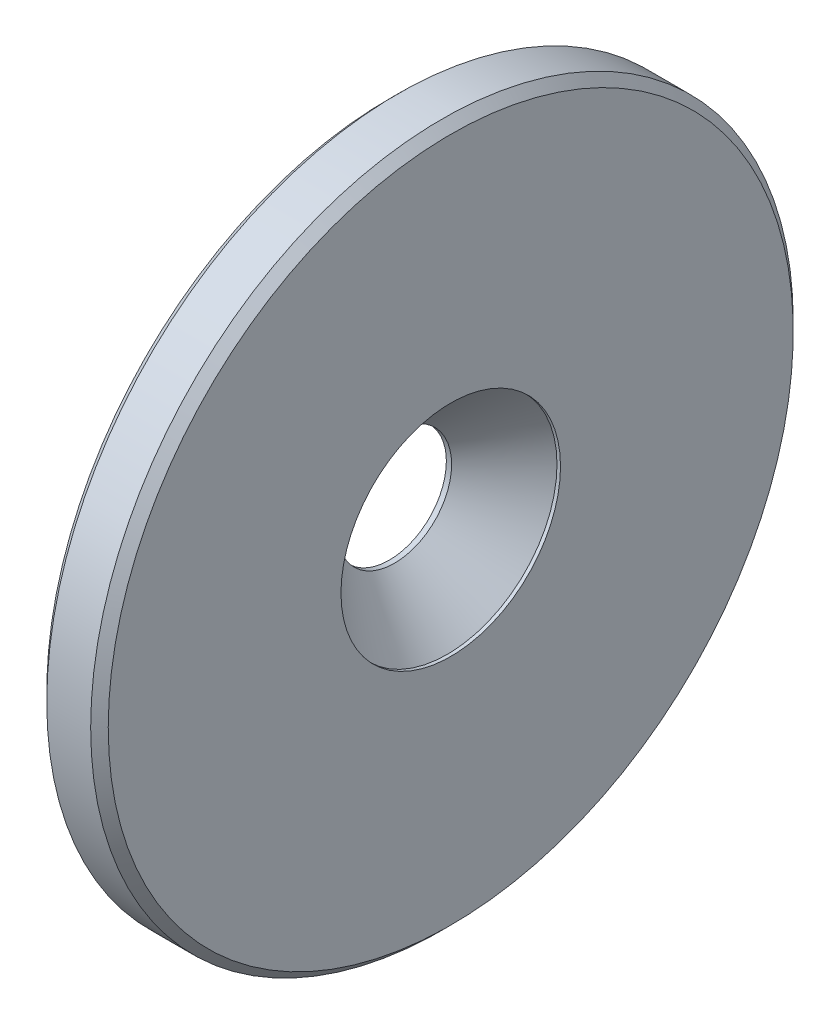
ISO-10303-21;
HEADER;
FILE_DESCRIPTION(('STEP AP214'),'2;1');
FILE_NAME('part.step','',(''),(''),'','','');
FILE_SCHEMA(('AUTOMOTIVE_DESIGN { 1 0 10303 214 1 1 1 1 }'));
ENDSEC;
DATA;
#1=APPLICATION_CONTEXT('core data for automotive mechanical design processes');
#2=APPLICATION_PROTOCOL_DEFINITION('international standard','automotive_design',2000,#1);
#3=PRODUCT_CONTEXT('',#1,'mechanical');
#4=PRODUCT('Part','Part','',(#3));
#5=PRODUCT_RELATED_PRODUCT_CATEGORY('part','',(#4));
#6=PRODUCT_DEFINITION_FORMATION('','',#4);
#7=PRODUCT_DEFINITION_CONTEXT('part definition',#1,'design');
#8=PRODUCT_DEFINITION('design','',#6,#7);
#9=PRODUCT_DEFINITION_SHAPE('','',#8);
#10=(LENGTH_UNIT() NAMED_UNIT(*) SI_UNIT(.MILLI.,.METRE.));
#11=(NAMED_UNIT(*) PLANE_ANGLE_UNIT() SI_UNIT($,.RADIAN.));
#12=(NAMED_UNIT(*) SI_UNIT($,.STERADIAN.) SOLID_ANGLE_UNIT());
#13=UNCERTAINTY_MEASURE_WITH_UNIT(LENGTH_MEASURE(1.E-05),#10,'distance_accuracy_value','');
#14=(GEOMETRIC_REPRESENTATION_CONTEXT(3) GLOBAL_UNCERTAINTY_ASSIGNED_CONTEXT((#13)) GLOBAL_UNIT_ASSIGNED_CONTEXT((#10,
#11,#12)) REPRESENTATION_CONTEXT('',''));
#15=CARTESIAN_POINT('',(0.,0.,0.));
#16=DIRECTION('',(0.,0.,1.));
#17=DIRECTION('',(1.,0.,0.));
#18=AXIS2_PLACEMENT_3D('',#15,#16,#17);
#19=CARTESIAN_POINT('',(-2.456628621,0.,19.5));
#20=CARTESIAN_POINT('',(-2.956628621,0.,20.));
#21=(BOUNDED_CURVE() B_SPLINE_CURVE(1,(#19,#20),.UNSPECIFIED.,.F.,
.F.) B_SPLINE_CURVE_WITH_KNOTS((2,2),(0.,1.0000000000001),
.UNSPECIFIED.) CURVE() GEOMETRIC_REPRESENTATION_ITEM() RATIONAL_B_SPLINE_CURVE((1.,1.)) REPRESENTATION_ITEM(''));
#22=CARTESIAN_POINT('',(997.043371379,0.,0.));
#23=DIRECTION('',(-1.,0.,0.));
#24=AXIS1_PLACEMENT('',#22,#23);
#25=SURFACE_OF_REVOLUTION('',#21,#24);
#26=CARTESIAN_POINT('',(-2.45662862100005,0.,0.));
#27=DIRECTION('',(-1.,0.,0.));
#28=DIRECTION('',(0.,0.,1.));
#29=AXIS2_PLACEMENT_3D('',#26,#27,#28);
#30=CIRCLE('',#29,19.5);
#31=CARTESIAN_POINT('',(-2.45662862100005,0.,19.5));
#32=VERTEX_POINT('',#31);
#33=EDGE_CURVE('E122',#32,#32,#30,.F.);
#34=ORIENTED_EDGE('',*,*,#33,.F.);
#35=EDGE_LOOP('',(#34));
#36=FACE_BOUND('',#35,.T.);
#37=CARTESIAN_POINT('',(-2.95662862099999,0.,0.));
#38=DIRECTION('',(-1.,0.,0.));
#39=DIRECTION('',(0.,0.,1.));
#40=AXIS2_PLACEMENT_3D('',#37,#38,#39);
#41=CIRCLE('',#40,20.);
#42=CARTESIAN_POINT('',(-2.956628621,0.,20.));
#43=VERTEX_POINT('',#42);
#44=EDGE_CURVE('E20',#43,#43,#41,.F.);
#45=ORIENTED_EDGE('',*,*,#44,.T.);
#46=EDGE_LOOP('',(#45));
#47=FACE_BOUND('',#46,.T.);
#48=ADVANCED_FACE('F15',(#36,#47),#25,.T.);
#49=CARTESIAN_POINT('',(-5.456628621,0.,-20.));
#50=CARTESIAN_POINT('',(-2.956628621,0.,-20.));
#51=(BOUNDED_CURVE() B_SPLINE_CURVE(1,(#49,#50),.UNSPECIFIED.,.F.,
.F.) B_SPLINE_CURVE_WITH_KNOTS((2,2),(0.,1.),
.UNSPECIFIED.) CURVE() GEOMETRIC_REPRESENTATION_ITEM() RATIONAL_B_SPLINE_CURVE((1.,1.)) REPRESENTATION_ITEM(''));
#52=CARTESIAN_POINT('',(-4.206628621,0.,0.));
#53=DIRECTION('',(1.,0.,0.));
#54=AXIS1_PLACEMENT('',#52,#53);
#55=SURFACE_OF_REVOLUTION('',#51,#54);
#56=ORIENTED_EDGE('',*,*,#44,.F.);
#57=EDGE_LOOP('',(#56));
#58=FACE_BOUND('',#57,.T.);
#59=CARTESIAN_POINT('',(-5.456628621,0.,0.));
#60=DIRECTION('',(1.,0.,0.));
#61=DIRECTION('',(0.,0.,-1.));
#62=AXIS2_PLACEMENT_3D('',#59,#60,#61);
#63=CIRCLE('',#62,20.);
#64=CARTESIAN_POINT('',(-5.456628621,0.,-20.));
#65=VERTEX_POINT('',#64);
#66=EDGE_CURVE('E95',#65,#65,#63,.T.);
#67=ORIENTED_EDGE('',*,*,#66,.T.);
#68=EDGE_LOOP('',(#67));
#69=FACE_BOUND('',#68,.T.);
#70=ADVANCED_FACE('F100',(#58,#69),#55,.T.);
#71=CARTESIAN_POINT('',(-2.456628621,-19.734,19.734));
#72=DIRECTION('',(1.,0.,0.));
#73=DIRECTION('',(0.,0.,-1.));
#74=AXIS2_PLACEMENT_3D('',#71,#72,#73);
#75=PLANE('',#74);
#76=CARTESIAN_POINT('',(-2.456628621,-1.70919590767886E-09,6.25));
#77=CARTESIAN_POINT('',(-2.456628621,-0.133418009315424,6.25000114171124));
#78=CARTESIAN_POINT('',(-2.456628621,-0.266827250447878,6.24573033955721));
#79=CARTESIAN_POINT('',(-2.456628621,-0.668786420216858,6.21994332536144));
#80=CARTESIAN_POINT('',(-2.456628621,-0.936609461341284,6.18529440879161));
#81=CARTESIAN_POINT('',(-2.456628621,-1.46597508643248,6.08163624863713));
#82=CARTESIAN_POINT('',(-2.456628621,-1.72750605160964,6.01256789334141));
#83=CARTESIAN_POINT('',(-2.456628621,-2.15000328894912,5.87119170776928));
#84=CARTESIAN_POINT('',(-2.456628621,-2.31422213114927,5.80842063063734));
#85=CARTESIAN_POINT('',(-2.456628621,-2.63684218021176,5.66925170217592));
#86=CARTESIAN_POINT('',(-2.456628621,-2.79524229210747,5.59285130176601));
#87=CARTESIAN_POINT('',(-2.456628621,-3.10504472139954,5.4269768801466));
#88=CARTESIAN_POINT('',(-2.456628621,-3.25644672679586,5.33750227678207));
#89=CARTESIAN_POINT('',(-2.456628621,-3.55123007634737,5.14608186922227));
#90=CARTESIAN_POINT('',(-2.456628621,-3.69460850398876,5.04413157256313));
#91=CARTESIAN_POINT('',(-2.456628621,-3.97219537464824,4.82856402150704));
#92=CARTESIAN_POINT('',(-2.456628621,-4.10640827530324,4.71495250679425));
#93=CARTESIAN_POINT('',(-2.456628621,-4.36483548940189,4.47678449351898));
#94=CARTESIAN_POINT('',(-2.456628621,-4.48904609904461,4.35222397597812));
#95=CARTESIAN_POINT('',(-2.456628621,-4.72647803530695,4.09313658085828));
#96=CARTESIAN_POINT('',(-2.456628621,-4.83970414117487,3.95861408296956));
#97=CARTESIAN_POINT('',(-2.456628621,-5.05446373599661,3.68045929162848));
#98=CARTESIAN_POINT('',(-2.456628621,-5.15599289338394,3.53682365377403));
#99=CARTESIAN_POINT('',(-2.456628621,-5.34655569549157,3.24155912841239));
#100=CARTESIAN_POINT('',(-2.456628621,-5.43559358091826,3.08993297779852));
#101=CARTESIAN_POINT('',(-2.456628621,-5.60061255979717,2.77966275136351));
#102=CARTESIAN_POINT('',(-2.456628621,-5.67658882028543,2.62101610505567));
#103=CARTESIAN_POINT('',(-2.456628621,-5.81487920816227,2.29794339417651));
#104=CARTESIAN_POINT('',(-2.456628621,-5.87719822109864,2.13351942080661));
#105=CARTESIAN_POINT('',(-2.456628621,-5.98778627703081,1.79994506528143));
#106=CARTESIAN_POINT('',(-2.456628621,-6.03605012075745,1.63079295939667));
#107=CARTESIAN_POINT('',(-2.456628621,-6.11813821940989,1.28908816765005));
#108=CARTESIAN_POINT('',(-2.456628621,-6.15196791089933,1.11653678777438));
#109=CARTESIAN_POINT('',(-2.456628621,-6.20498359898895,0.769132691892729));
#110=CARTESIAN_POINT('',(-2.456628621,-6.22416411014575,0.594279138735012));
#111=CARTESIAN_POINT('',(-2.456628621,-6.24771923141149,0.243650404742118));
#112=CARTESIAN_POINT('',(-2.456628621,-6.2520999666827,0.0678756353439615));
#113=CARTESIAN_POINT('',(-2.456628621,-6.24604017479397,-0.283498014307173));
#114=CARTESIAN_POINT('',(-2.456628621,-6.23559293051138,-0.459096778762252));
#115=CARTESIAN_POINT('',(-2.456628621,-6.19993947481932,-0.808788782308092));
#116=CARTESIAN_POINT('',(-2.456628621,-6.17473332594914,-0.982882027775158));
#117=CARTESIAN_POINT('',(-2.456628621,-6.10975615595501,-1.32824717140137));
#118=CARTESIAN_POINT('',(-2.456628621,-6.06999173706533,-1.49952031175462));
#119=CARTESIAN_POINT('',(-2.456628621,-5.97615920262878,-1.83818062505333));
#120=CARTESIAN_POINT('',(-2.456628621,-5.92208504996282,-2.00556612534847));
#121=CARTESIAN_POINT('',(-2.456628621,-5.80004828343207,-2.33512392559846));
#122=CARTESIAN_POINT('',(-2.456628621,-5.73209087304566,-2.4972981524725));
#123=CARTESIAN_POINT('',(-2.456628621,-5.58272783036744,-2.81541092236805));
#124=CARTESIAN_POINT('',(-2.456628621,-5.50131676929111,-2.97134691647388));
#125=CARTESIAN_POINT('',(-2.456628621,-5.3256773580835,-3.2757482620844));
#126=CARTESIAN_POINT('',(-2.456628621,-5.23145375305377,-3.42421635155814));
#127=CARTESIAN_POINT('',(-2.456628621,-5.03080625067261,-3.71273114849931));
#128=CARTESIAN_POINT('',(-2.456628621,-4.92437875926699,-3.85277535651915));
#129=CARTESIAN_POINT('',(-2.456628621,-4.70014429196179,-4.12334876742316));
#130=CARTESIAN_POINT('',(-2.456628621,-4.58234153137009,-4.25388146374337));
#131=CARTESIAN_POINT('',(-2.456628621,-4.33613494365613,-4.5045874301741));
#132=CARTESIAN_POINT('',(-2.456628621,-4.20772891464338,-4.62475853793711));
#133=CARTESIAN_POINT('',(-2.456628621,-3.94129918623,-4.85381419298259));
#134=CARTESIAN_POINT('',(-2.456628621,-3.80327905212002,-4.96270288735932));
#135=CARTESIAN_POINT('',(-2.456628621,-3.51845041329473,-5.16854963408473));
#136=CARTESIAN_POINT('',(-2.456628621,-3.37163526433438,-5.26549849306785));
#137=CARTESIAN_POINT('',(-2.456628621,-3.07041259358816,-5.44664505528296));
#138=CARTESIAN_POINT('',(-2.456628621,-2.91600789350336,-5.53084745069657));
#139=CARTESIAN_POINT('',(-2.456628621,-2.60048817378036,-5.68602694346657));
#140=CARTESIAN_POINT('',(-2.456628621,-2.43936627008721,-5.75699004369127));
#141=CARTESIAN_POINT('',(-2.456628621,-2.11177246890117,-5.88505170952893));
#142=CARTESIAN_POINT('',(-2.456628621,-1.94530260138815,-5.94215546707557));
#143=CARTESIAN_POINT('',(-2.456628621,-1.60836902858592,-6.04205990112899));
#144=CARTESIAN_POINT('',(-2.456628621,-1.43791090876787,-6.08487943336063));
#145=CARTESIAN_POINT('',(-2.456628621,-1.09406311004606,-6.15599911285454));
#146=CARTESIAN_POINT('',(-2.456628621,-0.92067487735144,-6.1843062185607));
#147=CARTESIAN_POINT('',(-2.456628621,-0.622556699400929,-6.22016884635642));
#148=CARTESIAN_POINT('',(-2.456628621,-0.498250501425751,-6.23135771552954));
#149=CARTESIAN_POINT('',(-2.456628621,-0.24929337661775,-6.24626938971483));
#150=CARTESIAN_POINT('',(-2.456628621,-0.124642862885092,-6.24999893333965));
#151=CARTESIAN_POINT('',(-2.456628621,0.133418007231994,-6.25000114175571));
#152=CARTESIAN_POINT('',(-2.456628621,0.266827248365936,-6.24573033964615));
#153=CARTESIAN_POINT('',(-2.456628621,0.668786418143677,-6.21994332558437));
#154=CARTESIAN_POINT('',(-2.456628621,0.936609459279663,-6.1852944091038));
#155=CARTESIAN_POINT('',(-2.456628621,1.46597508440537,-6.08163624912575));
#156=CARTESIAN_POINT('',(-2.456628621,1.72750604960551,-6.01256789391722));
#157=CARTESIAN_POINT('',(-2.456628621,2.15000328699205,-5.87119170848595));
#158=CARTESIAN_POINT('',(-2.456628621,2.31422212921312,-5.80842063140875));
#159=CARTESIAN_POINT('',(-2.456628621,2.63684217832198,-5.66925170305488));
#160=CARTESIAN_POINT('',(-2.456628621,2.79524229024315,-5.59285130269777));
#161=CARTESIAN_POINT('',(-2.456628621,3.10504471959051,-5.42697688118163));
#162=CARTESIAN_POINT('',(-2.456628621,3.25644672501667,-5.33750227786757));
#163=CARTESIAN_POINT('',(-2.456628621,3.55123007463199,-5.14608187040602));
#164=CARTESIAN_POINT('',(-2.456628621,3.69460850230738,-5.04413157379467));
#165=CARTESIAN_POINT('',(-2.456628621,3.97219537303872,-4.8285640228311));
#166=CARTESIAN_POINT('',(-2.456628621,4.10640827373159,-4.71495250816305));
#167=CARTESIAN_POINT('',(-2.456628621,4.36483548790963,-4.47678449497392));
#168=CARTESIAN_POINT('',(-2.456628621,4.48904609759388,-4.35222397747446));
#169=CARTESIAN_POINT('',(-2.456628621,4.72647803394258,-4.09313658243376));
#170=CARTESIAN_POINT('',(-2.456628621,4.83970413985533,-3.95861408458279));
#171=CARTESIAN_POINT('',(-2.456628621,5.05446373476979,-3.6804592933133));
#172=CARTESIAN_POINT('',(-2.456628621,5.155992892205,-3.53682365549269));
#173=CARTESIAN_POINT('',(-2.456628621,5.34655569441105,-3.24155913019457));
#174=CARTESIAN_POINT('',(-2.456628621,5.43559357988829,-3.08993297961038));
#175=CARTESIAN_POINT('',(-2.456628621,5.60061255887061,-2.77966275323038));
#176=CARTESIAN_POINT('',(-2.456628621,5.67658881941176,-2.62101610694787));
#177=CARTESIAN_POINT('',(-2.456628621,5.81487920739629,-2.2979433961148));
#178=CARTESIAN_POINT('',(-2.456628621,5.87719822038747,-2.13351942276568));
#179=CARTESIAN_POINT('',(-2.456628621,5.98778627643082,-1.79994506727736));
#180=CARTESIAN_POINT('',(-2.456628621,6.03605012021386,-1.63079296140868));
#181=CARTESIAN_POINT('',(-2.456628621,6.11813821898019,-1.28908816968943));
#182=CARTESIAN_POINT('',(-2.456628621,6.15196791052715,-1.11653678982504));
#183=CARTESIAN_POINT('',(-2.456628621,6.20498359873257,-0.769132693961054));
#184=CARTESIAN_POINT('',(-2.456628621,6.22416410994766,-0.594279140809731));
#185=CARTESIAN_POINT('',(-2.456628621,6.24771923133027,-0.243650406824689));
#186=CARTESIAN_POINT('',(-2.456628621,6.25209996666007,-0.0678756374279923));
#187=CARTESIAN_POINT('',(-2.456628621,6.24604017488847,0.283498012225163));
#188=CARTESIAN_POINT('',(-2.456628621,6.23559293066441,0.459096776683724));
#189=CARTESIAN_POINT('',(-2.456628621,6.19993947508891,0.808788780241453));
#190=CARTESIAN_POINT('',(-2.456628621,6.17473332627676,0.982882025716926));
#191=CARTESIAN_POINT('',(-2.456628621,6.10975615639776,1.3282471693648));
#192=CARTESIAN_POINT('',(-2.456628621,6.06999173756516,1.49952030973132));
#193=CARTESIAN_POINT('',(-2.456628621,5.9761592032415,1.83818062306131));
#194=CARTESIAN_POINT('',(-2.456628621,5.92208505063134,2.00556612337446));
#195=CARTESIAN_POINT('',(-2.456628621,5.80004828421044,2.33512392366512));
#196=CARTESIAN_POINT('',(-2.456628621,5.73209087387809,2.49729815056181));
#197=CARTESIAN_POINT('',(-2.456628621,5.58272783130593,2.81541092050711));
#198=CARTESIAN_POINT('',(-2.456628621,5.50131677028159,2.97134691464005));
#199=CARTESIAN_POINT('',(-2.456628621,5.32567735917547,3.27574826030907));
#200=CARTESIAN_POINT('',(-2.456628621,5.23145375419526,3.4242163498142));
#201=CARTESIAN_POINT('',(-2.456628621,5.03080625191028,3.71273114682226));
#202=CARTESIAN_POINT('',(-2.456628621,4.92437876055132,3.8527753548776));
#203=CARTESIAN_POINT('',(-2.456628621,4.70014429333628,4.12334876585641));
#204=CARTESIAN_POINT('',(-2.456628621,4.58234153278807,4.2538814622159));
#205=CARTESIAN_POINT('',(-2.456628621,4.33613494515756,4.50458742872883));
#206=CARTESIAN_POINT('',(-2.456628621,4.20772891618476,4.62475853653473));
#207=CARTESIAN_POINT('',(-2.456628621,3.9412991878475,4.85381419166919));
#208=CARTESIAN_POINT('',(-2.456628621,3.80327905377369,4.96270288609199));
#209=CARTESIAN_POINT('',(-2.456628621,3.51845041501699,5.16854963291231));
#210=CARTESIAN_POINT('',(-2.456628621,3.37163526608906,5.26549849194427));
#211=CARTESIAN_POINT('',(-2.456628621,3.07041259540346,5.44664505425963));
#212=CARTESIAN_POINT('',(-2.456628621,2.91600789534684,5.53084744972463));
#213=CARTESIAN_POINT('',(-2.456628621,2.60048817567623,5.68602694259948));
#214=CARTESIAN_POINT('',(-2.456628621,2.43936627200728,5.75699004287767));
#215=CARTESIAN_POINT('',(-2.456628621,2.11177247086507,5.8850517088242));
#216=CARTESIAN_POINT('',(-2.456628621,1.94530260337166,5.9421554664262));
#217=CARTESIAN_POINT('',(-2.456628621,1.60836903060288,6.04205990059209));
#218=CARTESIAN_POINT('',(-2.456628621,1.43791091079864,6.08487943288075));
#219=CARTESIAN_POINT('',(-2.456628621,1.09406311209952,6.15599911248962));
#220=CARTESIAN_POINT('',(-2.456628621,0.920674879413773,6.1843062182537));
#221=CARTESIAN_POINT('',(-2.456628621,0.622556700784297,6.2201688462319));
#222=CARTESIAN_POINT('',(-2.456628621,0.498250502117834,6.23135771548813));
#223=CARTESIAN_POINT('',(-2.456628621,0.249293375923345,6.24626938975639));
#224=CARTESIAN_POINT('',(-2.456628621,0.124642861495489,6.24999893338118));
#225=CARTESIAN_POINT('',(-2.456628621,-1.70919590767886E-09,6.25));
#226=B_SPLINE_CURVE_WITH_KNOTS('',3,(#76,#77,#78,#79,#80,#81,#82,#83,#84,#85,#86,#87,#88,#89,
#90,#91,#92,#93,#94,#95,#96,#97,#98,#99,#100,#101,#102,#103,#104,#105,#106,#107,#108,#109,#110,
#111,#112,#113,#114,#115,#116,#117,#118,#119,#120,#121,#122,#123,#124,#125,#126,#127,#128,#129,
#130,#131,#132,#133,#134,#135,#136,#137,#138,#139,#140,#141,#142,#143,#144,#145,#146,#147,#148,
#149,#150,#151,#152,#153,#154,#155,#156,#157,#158,#159,#160,#161,#162,#163,#164,#165,#166,#167,
#168,#169,#170,#171,#172,#173,#174,#175,#176,#177,#178,#179,#180,#181,#182,#183,#184,#185,#186,
#187,#188,#189,#190,#191,#192,#193,#194,#195,#196,#197,#198,#199,#200,#201,#202,#203,#204,#205,
#206,#207,#208,#209,#210,#211,#212,#213,#214,#215,#216,#217,#218,#219,#220,#221,#222,#223,#224,
#225),.UNSPECIFIED.,.T.,.F.,(4,2,2,2,2,2,2,2,2,2,2,2,2,2,2,2,2,2,2,2,2,2,2,2,2,2,2,2,2,2,2,2,2,
2,2,2,2,2,2,2,2,2,2,2,2,2,2,2,2,2,2,2,2,2,2,2,2,2,2,2,2,2,2,2,2,2,2,2,2,2,2,2,2,2,4),(0.,
0.400205167889901,1.20795084206719,2.01708853877291,2.54393813744209,3.07088637583592,
3.59785808480761,4.12502011639972,4.65192391042903,5.17902192572155,5.70588956759682,
6.232951694047,6.75983445103648,7.28691174356751,7.8138001781356,8.34088327169625,
8.86776766596892,9.3948492575831,9.92171267994428,10.4488148493285,10.9759147851895,
11.502775974604,12.0298597963015,12.5567464269608,13.0838461871163,13.610751265849,
14.1378119190152,14.6646780046075,15.1916537764723,15.7184351547002,16.245619638257,
16.7726095821834,17.3001535629329,17.8274996110861,18.3541467619413,18.8805411583665,
19.2547623214926,19.6286452673745,20.0288504352644,20.8365961094419,21.6457338061474,
22.1725834048166,22.6995316432104,23.2265033521821,23.7536653837742,24.2805691778035,
24.8076671930961,25.3345348349713,25.8615969614215,26.388479718411,26.915557010942,
27.4424454455101,27.9695285390708,28.4964129333434,29.0234945249576,29.5503579473188,
30.0774601167031,30.604560052564,31.1314212419785,31.658505063676,32.1853916943353,
32.7124914544908,33.2393965332233,33.7664571863896,34.293323271982,34.8202990438472,
35.3470804220756,35.874264905632,36.4012548495579,36.9287988303056,37.4561448784571,
37.9827920293137,38.5091864257411,38.8834075909513,39.2572905389138),.UNSPECIFIED.);
#227=CARTESIAN_POINT('',(-2.456628621,-1.70919590767886E-09,6.25));
#228=VERTEX_POINT('',#227);
#229=EDGE_CURVE('E87',#228,#228,#226,.T.);
#230=ORIENTED_EDGE('',*,*,#229,.F.);
#231=EDGE_LOOP('',(#230));
#232=FACE_BOUND('',#231,.T.);
#233=ORIENTED_EDGE('',*,*,#33,.T.);
#234=EDGE_LOOP('',(#233));
#235=FACE_BOUND('',#234,.T.);
#236=ADVANCED_FACE('F96',(#232,#235),#75,.T.);
#237=CARTESIAN_POINT('',(-5.956628621,0.,-19.5));
#238=CARTESIAN_POINT('',(-5.456628621,0.,-20.));
#239=(BOUNDED_CURVE() B_SPLINE_CURVE(1,(#237,#238),.UNSPECIFIED.,.F.,
.F.) B_SPLINE_CURVE_WITH_KNOTS((2,2),(0.,1.),
.UNSPECIFIED.) CURVE() GEOMETRIC_REPRESENTATION_ITEM() RATIONAL_B_SPLINE_CURVE((1.,1.)) REPRESENTATION_ITEM(''));
#240=CARTESIAN_POINT('',(-1005.456628621,0.,0.));
#241=DIRECTION('',(1.,0.,0.));
#242=AXIS1_PLACEMENT('',#240,#241);
#243=SURFACE_OF_REVOLUTION('',#239,#242);
#244=ORIENTED_EDGE('',*,*,#66,.F.);
#245=EDGE_LOOP('',(#244));
#246=FACE_BOUND('',#245,.T.);
#247=CARTESIAN_POINT('',(-5.95662862099999,0.,0.));
#248=DIRECTION('',(1.,0.,0.));
#249=DIRECTION('',(0.,0.,-1.));
#250=AXIS2_PLACEMENT_3D('',#247,#248,#249);
#251=CIRCLE('',#250,19.5);
#252=CARTESIAN_POINT('',(-5.95662862099999,0.,-19.5));
#253=VERTEX_POINT('',#252);
#254=EDGE_CURVE('E94',#253,#253,#251,.F.);
#255=ORIENTED_EDGE('',*,*,#254,.F.);
#256=EDGE_LOOP('',(#255));
#257=FACE_BOUND('',#256,.T.);
#258=ADVANCED_FACE('F83',(#246,#257),#243,.T.);
#259=CARTESIAN_POINT('',(-2.656628621,0.,-6.25));
#260=CARTESIAN_POINT('',(-2.456628621,0.,-6.25));
#261=(BOUNDED_CURVE() B_SPLINE_CURVE(1,(#259,#260),.UNSPECIFIED.,.F.,
.F.) B_SPLINE_CURVE_WITH_KNOTS((2,2),(0.,1.),
.UNSPECIFIED.) CURVE() GEOMETRIC_REPRESENTATION_ITEM() RATIONAL_B_SPLINE_CURVE((1.,1.)) REPRESENTATION_ITEM(''));
#262=CARTESIAN_POINT('',(-2.556628621,0.,0.));
#263=DIRECTION('',(1.,0.,0.));
#264=AXIS1_PLACEMENT('',#262,#263);
#265=SURFACE_OF_REVOLUTION('',#261,#264);
#266=ORIENTED_EDGE('',*,*,#229,.T.);
#267=EDGE_LOOP('',(#266));
#268=FACE_BOUND('',#267,.T.);
#269=CARTESIAN_POINT('',(-2.65662862100002,0.,0.));
#270=DIRECTION('',(1.,0.,0.));
#271=DIRECTION('',(0.,0.,-1.));
#272=AXIS2_PLACEMENT_3D('',#269,#270,#271);
#273=CIRCLE('',#272,6.25);
#274=CARTESIAN_POINT('',(-2.656628621,0.,-6.25));
#275=VERTEX_POINT('',#274);
#276=EDGE_CURVE('E34',#275,#275,#273,.T.);
#277=ORIENTED_EDGE('',*,*,#276,.F.);
#278=EDGE_LOOP('',(#277));
#279=FACE_BOUND('',#278,.T.);
#280=ADVANCED_FACE('F79',(#268,#279),#265,.F.);
#281=CARTESIAN_POINT('',(-5.956628621,-19.734,-19.734));
#282=DIRECTION('',(-1.,0.,0.));
#283=DIRECTION('',(0.,0.,1.));
#284=AXIS2_PLACEMENT_3D('',#281,#282,#283);
#285=PLANE('',#284);
#286=CARTESIAN_POINT('',(-5.956628621,-1.94550505696004E-10,-3.25));
#287=CARTESIAN_POINT('',(-5.956628621,-0.100569859287421,-3.25000170918039));
#288=CARTESIAN_POINT('',(-5.956628621,-0.20111673016682,-3.24532784070037));
#289=CARTESIAN_POINT('',(-5.956628621,-0.401381428199554,-3.22668853590113));
#290=CARTESIAN_POINT('',(-5.956628621,-0.501098830869839,-3.21271860684454));
#291=CARTESIAN_POINT('',(-5.956628621,-0.779387033086154,-3.16042874204492));
#292=CARTESIAN_POINT('',(-5.956628621,-0.956088761260602,-3.11154464042386));
#293=CARTESIAN_POINT('',(-5.956628621,-1.29892643996143,-2.98475805991951));
#294=CARTESIAN_POINT('',(-5.956628621,-1.46504820033837,-2.90681753103513));
#295=CARTESIAN_POINT('',(-5.956628621,-1.78177808204428,-2.72417875025682));
#296=CARTESIAN_POINT('',(-5.956628621,-1.93239414332093,-2.61949428961178));
#297=CARTESIAN_POINT('',(-5.956628621,-2.21386439151047,-2.38635630356589));
#298=CARTESIAN_POINT('',(-5.956628621,-2.34472416457148,-2.25790951997646));
#299=CARTESIAN_POINT('',(-5.956628621,-2.58304119723127,-1.98085545805101));
#300=CARTESIAN_POINT('',(-5.956628621,-2.69049570958624,-1.83224581637413));
#301=CARTESIAN_POINT('',(-5.956628621,-2.87893496619002,-1.51908853696464));
#302=CARTESIAN_POINT('',(-5.956628621,-2.95991842027794,-1.35454012290596));
#303=CARTESIAN_POINT('',(-5.956628621,-3.09310847000752,-1.01418642642526));
#304=CARTESIAN_POINT('',(-5.956628621,-3.14531570725275,-0.838381395081893));
#305=CARTESIAN_POINT('',(-5.956628621,-3.21947378086641,-0.480502516385657));
#306=CARTESIAN_POINT('',(-5.956628621,-3.24142474233089,-0.298428694954601));
#307=CARTESIAN_POINT('',(-5.956628621,-3.25444760220198,0.0668202246148634));
#308=CARTESIAN_POINT('',(-5.956628621,-3.24551945174014,0.249995324495668));
#309=CARTESIAN_POINT('',(-5.956628621,-3.19703736673048,0.612246892504674));
#310=CARTESIAN_POINT('',(-5.956628621,-3.15748340249314,0.791323356659372));
#311=CARTESIAN_POINT('',(-5.956628621,-3.04887206490006,1.14029560482434));
#312=CARTESIAN_POINT('',(-5.956628621,-2.97981442190466,1.31019130491389));
#313=CARTESIAN_POINT('',(-5.956628621,-2.81415733602649,1.63597421459181));
#314=CARTESIAN_POINT('',(-5.956628621,-2.7175584232944,1.79186169375292));
#315=CARTESIAN_POINT('',(-5.956628621,-2.49956660241103,2.08519988250619));
#316=CARTESIAN_POINT('',(-5.956628621,-2.37817482897358,2.22265143539269));
#317=CARTESIAN_POINT('',(-5.956628621,-2.11402095346754,2.47523926700863));
#318=CARTESIAN_POINT('',(-5.956628621,-1.97125648572993,2.59037307222296));
#319=CARTESIAN_POINT('',(-5.956628621,-1.66840735455449,2.79505607833104));
#320=CARTESIAN_POINT('',(-5.956628621,-1.50831931465729,2.8846002792431));
#321=CARTESIAN_POINT('',(-5.956628621,-1.17541342163873,3.03549926709631));
#322=CARTESIAN_POINT('',(-5.956628621,-1.00260198858223,3.09686815935467));
#323=CARTESIAN_POINT('',(-5.956628621,-0.691240519713676,3.17869959021141));
#324=CARTESIAN_POINT('',(-5.956628621,-0.554293190016999,3.20541386452279));
#325=CARTESIAN_POINT('',(-5.956628621,-0.278214133927169,3.24105273638778));
#326=CARTESIAN_POINT('',(-5.956628621,-0.139085083716726,3.24999763620872));
#327=CARTESIAN_POINT('',(-5.956628621,0.100569858203767,3.2500017092139));
#328=CARTESIAN_POINT('',(-5.956628621,0.201116729084616,3.24532784076743));
#329=CARTESIAN_POINT('',(-5.956628621,0.401381427123633,3.22668853603498));
#330=CARTESIAN_POINT('',(-5.956628621,0.501098829798749,3.21271860701161));
#331=CARTESIAN_POINT('',(-5.956628621,0.779387032032748,3.16042874230469));
#332=CARTESIAN_POINT('',(-5.956628621,0.956088760223595,3.11154464074251));
#333=CARTESIAN_POINT('',(-5.956628621,1.29892643896669,2.98475806035241));
#334=CARTESIAN_POINT('',(-5.956628621,1.46504819936951,2.90681753152343));
#335=CARTESIAN_POINT('',(-5.956628621,1.78177808113621,2.72417875085076));
#336=CARTESIAN_POINT('',(-5.956628621,1.93239414244774,2.61949429025593));
#337=CARTESIAN_POINT('',(-5.956628621,2.213864390715,2.38635630430387));
#338=CARTESIAN_POINT('',(-5.956628621,2.34472416381883,2.25790952075804));
#339=CARTESIAN_POINT('',(-5.956628621,2.58304119657099,1.98085545891202));
#340=CARTESIAN_POINT('',(-5.956628621,2.69049570897549,1.83224581727096));
#341=CARTESIAN_POINT('',(-5.956628621,2.87893496568366,1.51908853792428));
#342=CARTESIAN_POINT('',(-5.956628621,2.95991841982643,1.35454012389259));
#343=CARTESIAN_POINT('',(-5.956628621,3.09310846966945,1.0141864274563));
#344=CARTESIAN_POINT('',(-5.956628621,3.14531570697329,0.838381396130327));
#345=CARTESIAN_POINT('',(-5.956628621,3.21947378070624,0.48050251745881));
#346=CARTESIAN_POINT('',(-5.956628621,3.24142474223141,0.298428696035073));
#347=CARTESIAN_POINT('',(-5.956628621,3.25444760222426,-0.06682022353005));
#348=CARTESIAN_POINT('',(-5.956628621,3.24551945182348,-0.249995323413832));
#349=CARTESIAN_POINT('',(-5.956628621,3.19703736693456,-0.612246891438999));
#350=CARTESIAN_POINT('',(-5.956628621,3.15748340275692,-0.79132335560688));
#351=CARTESIAN_POINT('',(-5.956628621,3.04887206528017,-1.14029560380803));
#352=CARTESIAN_POINT('',(-5.956628621,2.9798144223414,-1.31019130392058));
#353=CARTESIAN_POINT('',(-5.956628621,2.81415733657184,-1.63597421365372));
#354=CARTESIAN_POINT('',(-5.956628621,2.7175584238917,-1.79186169284705));
#355=CARTESIAN_POINT('',(-5.956628621,2.49956660310602,-2.08519988167311));
#356=CARTESIAN_POINT('',(-5.956628621,2.37817482971429,-2.22265143460016));
#357=CARTESIAN_POINT('',(-5.956628621,2.11402095429243,-2.47523926630412));
#358=CARTESIAN_POINT('',(-5.956628621,1.9712564865933,-2.59037307156594));
#359=CARTESIAN_POINT('',(-5.956628621,1.66840735548665,-2.79505607777457));
#360=CARTESIAN_POINT('',(-5.956628621,1.50831931561979,-2.88460027873975));
#361=CARTESIAN_POINT('',(-5.956628621,1.17541342265182,-3.03549926670408));
#362=CARTESIAN_POINT('',(-5.956628621,1.0026019896155,-3.09686815902024));
#363=CARTESIAN_POINT('',(-5.956628621,0.691240520423739,-3.17869959007283));
#364=CARTESIAN_POINT('',(-5.956628621,0.55429319037452,-3.2054138644767));
#365=CARTESIAN_POINT('',(-5.956628621,0.278214133568159,-3.24105273643406));
#366=CARTESIAN_POINT('',(-5.956628621,0.139085082993749,-3.24999763625504));
#367=CARTESIAN_POINT('',(-5.956628621,-1.94550505696004E-10,-3.25));
#368=B_SPLINE_CURVE_WITH_KNOTS('',3,(#286,#287,#288,#289,#290,#291,#292,#293,#294,#295,#296,
#297,#298,#299,#300,#301,#302,#303,#304,#305,#306,#307,#308,#309,#310,#311,#312,#313,#314,#315,
#316,#317,#318,#319,#320,#321,#322,#323,#324,#325,#326,#327,#328,#329,#330,#331,#332,#333,#334,
#335,#336,#337,#338,#339,#340,#341,#342,#343,#344,#345,#346,#347,#348,#349,#350,#351,#352,#353,
#354,#355,#356,#357,#358,#359,#360,#361,#362,#363,#364,#365,#366,#367),.UNSPECIFIED.,.T.,.F.,(4,
2,2,2,2,2,2,2,2,2,2,2,2,2,2,2,2,2,2,2,2,2,2,2,2,2,2,2,2,2,2,2,2,2,2,2,2,2,2,2,4),(0.,
0.301549548789636,0.603244940845613,1.15046032353884,1.69839482786849,2.24604734295164,
2.79354471650036,3.34110631916518,3.88869460520845,4.43627068155708,4.98384449391884,
5.53141917285674,6.07899438262926,6.62657459690144,7.17414427133931,7.72168889035055,
8.26929416003772,8.81700635389513,9.36444404850224,9.78195528176952,10.1989892156787,
10.5005387644677,10.8022341565243,11.3494495392178,11.8973840435472,12.4450365586303,
12.992533932179,13.5400955348438,14.0876838208871,14.6352598972357,15.1828337095975,
15.7304083885354,16.2779835983079,16.82556381258,17.373133487018,17.9206781060296,
18.4682833757164,19.015995569572,19.5634332641809,19.9809444985304,20.3979784335195),.UNSPECIFIED.);
#369=CARTESIAN_POINT('',(-5.956628621,-1.94550505696004E-10,-3.25));
#370=VERTEX_POINT('',#369);
#371=EDGE_CURVE('E25',#370,#370,#368,.T.);
#372=ORIENTED_EDGE('',*,*,#371,.F.);
#373=EDGE_LOOP('',(#372));
#374=FACE_BOUND('',#373,.T.);
#375=ORIENTED_EDGE('',*,*,#254,.T.);
#376=EDGE_LOOP('',(#375));
#377=FACE_BOUND('',#376,.T.);
#378=ADVANCED_FACE('F17',(#374,#377),#285,.T.);
#379=CARTESIAN_POINT('',(-5.656628621,0.,-3.25));
#380=CARTESIAN_POINT('',(-2.656628621,0.,-6.25));
#381=(BOUNDED_CURVE() B_SPLINE_CURVE(1,(#379,#380),.UNSPECIFIED.,.F.,
.F.) B_SPLINE_CURVE_WITH_KNOTS((2,2),(0.,1.),
.UNSPECIFIED.) CURVE() GEOMETRIC_REPRESENTATION_ITEM() RATIONAL_B_SPLINE_CURVE((1.,1.)) REPRESENTATION_ITEM(''));
#382=CARTESIAN_POINT('',(-1002.656628621,0.,0.));
#383=DIRECTION('',(1.,0.,0.));
#384=AXIS1_PLACEMENT('',#382,#383);
#385=SURFACE_OF_REVOLUTION('',#381,#384);
#386=ORIENTED_EDGE('',*,*,#276,.T.);
#387=EDGE_LOOP('',(#386));
#388=FACE_BOUND('',#387,.T.);
#389=CARTESIAN_POINT('',(-5.656628621,0.,0.));
#390=DIRECTION('',(1.,0.,0.));
#391=DIRECTION('',(0.,0.,-1.));
#392=AXIS2_PLACEMENT_3D('',#389,#390,#391);
#393=CIRCLE('',#392,3.25);
#394=CARTESIAN_POINT('',(-5.656628621,0.,-3.25));
#395=VERTEX_POINT('',#394);
#396=EDGE_CURVE('E10',#395,#395,#393,.T.);
#397=ORIENTED_EDGE('',*,*,#396,.F.);
#398=EDGE_LOOP('',(#397));
#399=FACE_BOUND('',#398,.T.);
#400=ADVANCED_FACE('F52',(#388,#399),#385,.F.);
#401=CARTESIAN_POINT('',(-5.956628621,0.,-3.25));
#402=CARTESIAN_POINT('',(-5.656628621,0.,-3.25));
#403=(BOUNDED_CURVE() B_SPLINE_CURVE(1,(#401,#402),.UNSPECIFIED.,.F.,
.F.) B_SPLINE_CURVE_WITH_KNOTS((2,2),(0.,1.),
.UNSPECIFIED.) CURVE() GEOMETRIC_REPRESENTATION_ITEM() RATIONAL_B_SPLINE_CURVE((1.,1.)) REPRESENTATION_ITEM(''));
#404=CARTESIAN_POINT('',(-5.806628621,0.,0.));
#405=DIRECTION('',(1.,0.,0.));
#406=AXIS1_PLACEMENT('',#404,#405);
#407=SURFACE_OF_REVOLUTION('',#403,#406);
#408=ORIENTED_EDGE('',*,*,#371,.T.);
#409=EDGE_LOOP('',(#408));
#410=FACE_BOUND('',#409,.T.);
#411=ORIENTED_EDGE('',*,*,#396,.T.);
#412=EDGE_LOOP('',(#411));
#413=FACE_BOUND('',#412,.T.);
#414=ADVANCED_FACE('F47',(#410,#413),#407,.F.);
#415=CLOSED_SHELL('',(#48,#70,#236,#258,#280,#378,#400,#414));
#416=MANIFOLD_SOLID_BREP('B1',#415);
#417=ADVANCED_BREP_SHAPE_REPRESENTATION('',(#18,#416),#14);
#418=SHAPE_DEFINITION_REPRESENTATION(#9,#417);
ENDSEC;
END-ISO-10303-21;
